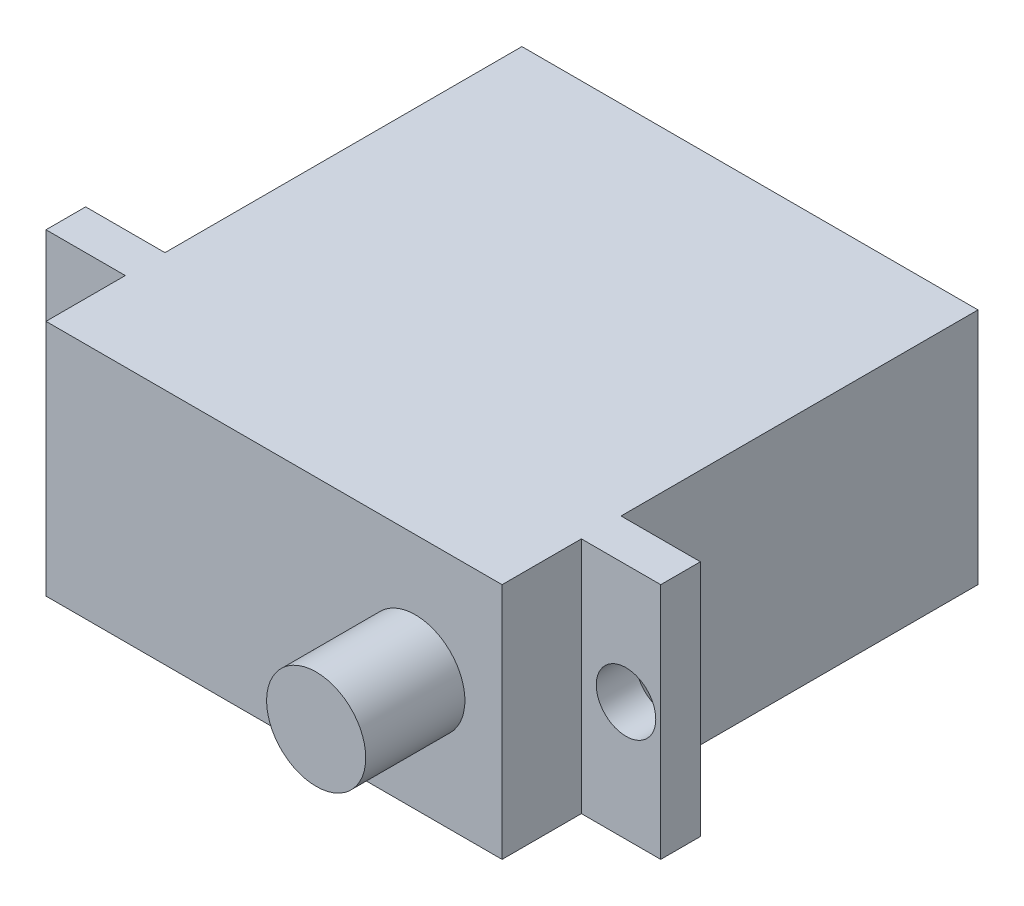
ISO-10303-21;
HEADER;
FILE_DESCRIPTION(('STEP AP214'),'2;1');
FILE_NAME('part.step','',(''),(''),'','','');
FILE_SCHEMA(('AUTOMOTIVE_DESIGN { 1 0 10303 214 1 1 1 1 }'));
ENDSEC;
DATA;
#1=APPLICATION_CONTEXT('core data for automotive mechanical design processes');
#2=APPLICATION_PROTOCOL_DEFINITION('international standard','automotive_design',2000,#1);
#3=PRODUCT_CONTEXT('',#1,'mechanical');
#4=PRODUCT('Part','Part','',(#3));
#5=PRODUCT_RELATED_PRODUCT_CATEGORY('part','',(#4));
#6=PRODUCT_DEFINITION_FORMATION('','',#4);
#7=PRODUCT_DEFINITION_CONTEXT('part definition',#1,'design');
#8=PRODUCT_DEFINITION('design','',#6,#7);
#9=PRODUCT_DEFINITION_SHAPE('','',#8);
#10=(LENGTH_UNIT() NAMED_UNIT(*) SI_UNIT(.MILLI.,.METRE.));
#11=(NAMED_UNIT(*) PLANE_ANGLE_UNIT() SI_UNIT($,.RADIAN.));
#12=(NAMED_UNIT(*) SI_UNIT($,.STERADIAN.) SOLID_ANGLE_UNIT());
#13=UNCERTAINTY_MEASURE_WITH_UNIT(LENGTH_MEASURE(1.E-05),#10,'distance_accuracy_value','');
#14=(GEOMETRIC_REPRESENTATION_CONTEXT(3) GLOBAL_UNCERTAINTY_ASSIGNED_CONTEXT((#13)) GLOBAL_UNIT_ASSIGNED_CONTEXT((#10,
#11,#12)) REPRESENTATION_CONTEXT('',''));
#15=CARTESIAN_POINT('',(0.,0.,0.));
#16=DIRECTION('',(0.,0.,1.));
#17=DIRECTION('',(1.,0.,0.));
#18=AXIS2_PLACEMENT_3D('',#15,#16,#17);
#19=CARTESIAN_POINT('',(0.,0.,20.));
#20=DIRECTION('',(0.,0.,-1.));
#21=DIRECTION('',(-1.,0.,0.));
#22=AXIS2_PLACEMENT_3D('',#19,#20,#21);
#23=PLANE('',#22);
#24=CARTESIAN_POINT('',(-2.25,6.,20.));
#25=DIRECTION('',(0.,0.,1.));
#26=DIRECTION('',(1.,0.,0.));
#27=AXIS2_PLACEMENT_3D('',#24,#25,#26);
#28=CIRCLE('',#27,1.5);
#29=CARTESIAN_POINT('',(-0.75,6.,20.));
#30=VERTEX_POINT('',#29);
#31=EDGE_CURVE('E164',#30,#30,#28,.T.);
#32=ORIENTED_EDGE('',*,*,#31,.F.);
#33=EDGE_LOOP('',(#32));
#34=FACE_BOUND('',#33,.T.);
#35=DIRECTION('',(0.,-1.,0.));
#36=VECTOR('',#35,1.);
#37=CARTESIAN_POINT('',(0.,0.,20.));
#38=LINE('',#37,#36);
#39=CARTESIAN_POINT('',(0.,12.,20.));
#40=VERTEX_POINT('',#39);
#41=CARTESIAN_POINT('',(0.,0.,20.));
#42=VERTEX_POINT('',#41);
#43=EDGE_CURVE('E150',#40,#42,#38,.T.);
#44=ORIENTED_EDGE('',*,*,#43,.F.);
#45=DIRECTION('',(-1.,0.,0.));
#46=VECTOR('',#45,1.);
#47=CARTESIAN_POINT('',(0.,12.,20.));
#48=LINE('',#47,#46);
#49=CARTESIAN_POINT('',(-4.,12.,20.));
#50=VERTEX_POINT('',#49);
#51=EDGE_CURVE('E211',#40,#50,#48,.T.);
#52=ORIENTED_EDGE('',*,*,#51,.T.);
#53=DIRECTION('',(0.,-1.,0.));
#54=VECTOR('',#53,1.);
#55=CARTESIAN_POINT('',(-4.,12.,20.));
#56=LINE('',#55,#54);
#57=CARTESIAN_POINT('',(-4.,0.,20.));
#58=VERTEX_POINT('',#57);
#59=EDGE_CURVE('E163',#50,#58,#56,.T.);
#60=ORIENTED_EDGE('',*,*,#59,.T.);
#61=DIRECTION('',(1.,0.,0.));
#62=VECTOR('',#61,1.);
#63=CARTESIAN_POINT('',(0.,0.,20.));
#64=LINE('',#63,#62);
#65=EDGE_CURVE('E62',#58,#42,#64,.T.);
#66=ORIENTED_EDGE('',*,*,#65,.T.);
#67=EDGE_LOOP('',(#44,#52,#60,#66));
#68=FACE_BOUND('',#67,.T.);
#69=ADVANCED_FACE('F39',(#34,#68),#23,.F.);
#70=CARTESIAN_POINT('',(25.25,6.,20.));
#71=DIRECTION('',(0.,0.,1.));
#72=DIRECTION('',(1.,0.,0.));
#73=AXIS2_PLACEMENT_3D('',#70,#71,#72);
#74=CIRCLE('',#73,1.5);
#75=CARTESIAN_POINT('',(26.75,6.,20.));
#76=VERTEX_POINT('',#75);
#77=EDGE_CURVE('E167',#76,#76,#74,.T.);
#78=ORIENTED_EDGE('',*,*,#77,.F.);
#79=EDGE_LOOP('',(#78));
#80=FACE_BOUND('',#79,.T.);
#81=DIRECTION('',(0.,1.,0.));
#82=VECTOR('',#81,1.);
#83=CARTESIAN_POINT('',(23.,0.,20.));
#84=LINE('',#83,#82);
#85=CARTESIAN_POINT('',(23.,0.,20.));
#86=VERTEX_POINT('',#85);
#87=CARTESIAN_POINT('',(23.,12.,20.));
#88=VERTEX_POINT('',#87);
#89=EDGE_CURVE('E54',#86,#88,#84,.T.);
#90=ORIENTED_EDGE('',*,*,#89,.F.);
#91=CARTESIAN_POINT('',(27.,0.,20.));
#92=VERTEX_POINT('',#91);
#93=EDGE_CURVE('E212',#86,#92,#64,.T.);
#94=ORIENTED_EDGE('',*,*,#93,.T.);
#95=DIRECTION('',(0.,1.,0.));
#96=VECTOR('',#95,1.);
#97=CARTESIAN_POINT('',(27.,12.,20.));
#98=LINE('',#97,#96);
#99=CARTESIAN_POINT('',(27.,12.,20.));
#100=VERTEX_POINT('',#99);
#101=EDGE_CURVE('E191',#92,#100,#98,.T.);
#102=ORIENTED_EDGE('',*,*,#101,.T.);
#103=EDGE_CURVE('E213',#100,#88,#48,.T.);
#104=ORIENTED_EDGE('',*,*,#103,.T.);
#105=EDGE_LOOP('',(#90,#94,#102,#104));
#106=FACE_BOUND('',#105,.T.);
#107=ADVANCED_FACE('F253',(#80,#106),#23,.F.);
#108=CARTESIAN_POINT('',(0.,0.,20.));
#109=DIRECTION('',(1.,0.,0.));
#110=DIRECTION('',(0.,0.,-1.));
#111=AXIS2_PLACEMENT_3D('',#108,#109,#110);
#112=PLANE('',#111);
#113=DIRECTION('',(0.,0.,-1.));
#114=VECTOR('',#113,1.);
#115=CARTESIAN_POINT('',(0.,0.,20.));
#116=LINE('',#115,#114);
#117=CARTESIAN_POINT('',(0.,0.,18.));
#118=VERTEX_POINT('',#117);
#119=CARTESIAN_POINT('',(0.,0.,0.));
#120=VERTEX_POINT('',#119);
#121=EDGE_CURVE('E47',#118,#120,#116,.T.);
#122=ORIENTED_EDGE('',*,*,#121,.F.);
#123=DIRECTION('',(0.,1.,0.));
#124=VECTOR('',#123,1.);
#125=CARTESIAN_POINT('',(0.,12.,18.));
#126=LINE('',#125,#124);
#127=CARTESIAN_POINT('',(0.,12.,18.));
#128=VERTEX_POINT('',#127);
#129=EDGE_CURVE('E168',#118,#128,#126,.T.);
#130=ORIENTED_EDGE('',*,*,#129,.T.);
#131=DIRECTION('',(0.,0.,-1.));
#132=VECTOR('',#131,1.);
#133=CARTESIAN_POINT('',(0.,12.,20.));
#134=LINE('',#133,#132);
#135=CARTESIAN_POINT('',(0.,12.,0.));
#136=VERTEX_POINT('',#135);
#137=EDGE_CURVE('E215',#128,#136,#134,.T.);
#138=ORIENTED_EDGE('',*,*,#137,.T.);
#139=DIRECTION('',(0.,-1.,0.));
#140=VECTOR('',#139,1.);
#141=CARTESIAN_POINT('',(0.,0.,0.));
#142=LINE('',#141,#140);
#143=EDGE_CURVE('E185',#136,#120,#142,.T.);
#144=ORIENTED_EDGE('',*,*,#143,.T.);
#145=EDGE_LOOP('',(#122,#130,#138,#144));
#146=FACE_BOUND('',#145,.T.);
#147=ADVANCED_FACE('F41',(#146),#112,.F.);
#148=CARTESIAN_POINT('',(0.,0.,20.));
#149=DIRECTION('',(0.,1.,0.));
#150=DIRECTION('',(0.,0.,1.));
#151=AXIS2_PLACEMENT_3D('',#148,#149,#150);
#152=PLANE('',#151);
#153=DIRECTION('',(1.,0.,0.));
#154=VECTOR('',#153,1.);
#155=CARTESIAN_POINT('',(0.,0.,0.));
#156=LINE('',#155,#154);
#157=CARTESIAN_POINT('',(23.,0.,0.));
#158=VERTEX_POINT('',#157);
#159=EDGE_CURVE('E218',#120,#158,#156,.T.);
#160=ORIENTED_EDGE('',*,*,#159,.T.);
#161=DIRECTION('',(0.,0.,-1.));
#162=VECTOR('',#161,1.);
#163=CARTESIAN_POINT('',(23.,0.,20.));
#164=LINE('',#163,#162);
#165=CARTESIAN_POINT('',(23.,0.,18.));
#166=VERTEX_POINT('',#165);
#167=EDGE_CURVE('E229',#166,#158,#164,.T.);
#168=ORIENTED_EDGE('',*,*,#167,.F.);
#169=DIRECTION('',(1.,0.,0.));
#170=VECTOR('',#169,1.);
#171=CARTESIAN_POINT('',(23.,0.,18.));
#172=LINE('',#171,#170);
#173=CARTESIAN_POINT('',(27.,0.,18.));
#174=VERTEX_POINT('',#173);
#175=EDGE_CURVE('E201',#166,#174,#172,.T.);
#176=ORIENTED_EDGE('',*,*,#175,.T.);
#177=DIRECTION('',(0.,0.,1.));
#178=VECTOR('',#177,1.);
#179=CARTESIAN_POINT('',(27.,0.,18.));
#180=LINE('',#179,#178);
#181=EDGE_CURVE('E154',#174,#92,#180,.T.);
#182=ORIENTED_EDGE('',*,*,#181,.T.);
#183=ORIENTED_EDGE('',*,*,#93,.F.);
#184=DIRECTION('',(0.,0.,-1.));
#185=VECTOR('',#184,1.);
#186=CARTESIAN_POINT('',(23.,0.,24.));
#187=LINE('',#186,#185);
#188=CARTESIAN_POINT('',(23.,0.,24.));
#189=VERTEX_POINT('',#188);
#190=EDGE_CURVE('E135',#189,#86,#187,.T.);
#191=ORIENTED_EDGE('',*,*,#190,.F.);
#192=DIRECTION('',(1.,0.,0.));
#193=VECTOR('',#192,1.);
#194=CARTESIAN_POINT('',(0.,0.,24.));
#195=LINE('',#194,#193);
#196=CARTESIAN_POINT('',(0.,0.,24.));
#197=VERTEX_POINT('',#196);
#198=EDGE_CURVE('E127',#197,#189,#195,.T.);
#199=ORIENTED_EDGE('',*,*,#198,.F.);
#200=DIRECTION('',(0.,0.,-1.));
#201=VECTOR('',#200,1.);
#202=CARTESIAN_POINT('',(0.,0.,24.));
#203=LINE('',#202,#201);
#204=EDGE_CURVE('E132',#197,#42,#203,.T.);
#205=ORIENTED_EDGE('',*,*,#204,.T.);
#206=ORIENTED_EDGE('',*,*,#65,.F.);
#207=DIRECTION('',(0.,0.,1.));
#208=VECTOR('',#207,1.);
#209=CARTESIAN_POINT('',(-4.,0.,18.));
#210=LINE('',#209,#208);
#211=CARTESIAN_POINT('',(-4.,0.,18.));
#212=VERTEX_POINT('',#211);
#213=EDGE_CURVE('E182',#212,#58,#210,.T.);
#214=ORIENTED_EDGE('',*,*,#213,.F.);
#215=DIRECTION('',(1.,0.,0.));
#216=VECTOR('',#215,1.);
#217=CARTESIAN_POINT('',(0.,0.,18.));
#218=LINE('',#217,#216);
#219=EDGE_CURVE('E177',#212,#118,#218,.T.);
#220=ORIENTED_EDGE('',*,*,#219,.T.);
#221=ORIENTED_EDGE('',*,*,#121,.T.);
#222=EDGE_LOOP('',(#160,#168,#176,#182,#183,#191,#199,#205,#206,#214,#220,#221));
#223=FACE_BOUND('',#222,.T.);
#224=ADVANCED_FACE('F130',(#223),#152,.F.);
#225=CARTESIAN_POINT('',(23.,0.,20.));
#226=DIRECTION('',(-1.,0.,0.));
#227=DIRECTION('',(0.,0.,1.));
#228=AXIS2_PLACEMENT_3D('',#225,#226,#227);
#229=PLANE('',#228);
#230=DIRECTION('',(0.,0.,-1.));
#231=VECTOR('',#230,1.);
#232=CARTESIAN_POINT('',(23.,12.,20.));
#233=LINE('',#232,#231);
#234=CARTESIAN_POINT('',(23.,12.,18.));
#235=VERTEX_POINT('',#234);
#236=CARTESIAN_POINT('',(23.,12.,0.));
#237=VERTEX_POINT('',#236);
#238=EDGE_CURVE('E227',#235,#237,#233,.T.);
#239=ORIENTED_EDGE('',*,*,#238,.F.);
#240=DIRECTION('',(0.,-1.,0.));
#241=VECTOR('',#240,1.);
#242=CARTESIAN_POINT('',(23.,12.,18.));
#243=LINE('',#242,#241);
#244=EDGE_CURVE('E195',#235,#166,#243,.T.);
#245=ORIENTED_EDGE('',*,*,#244,.T.);
#246=ORIENTED_EDGE('',*,*,#167,.T.);
#247=DIRECTION('',(0.,1.,0.));
#248=VECTOR('',#247,1.);
#249=CARTESIAN_POINT('',(23.,0.,0.));
#250=LINE('',#249,#248);
#251=EDGE_CURVE('E220',#158,#237,#250,.T.);
#252=ORIENTED_EDGE('',*,*,#251,.T.);
#253=EDGE_LOOP('',(#239,#245,#246,#252));
#254=FACE_BOUND('',#253,.T.);
#255=ADVANCED_FACE('F246',(#254),#229,.F.);
#256=CARTESIAN_POINT('',(0.,12.,20.));
#257=DIRECTION('',(0.,-1.,0.));
#258=DIRECTION('',(0.,0.,-1.));
#259=AXIS2_PLACEMENT_3D('',#256,#257,#258);
#260=PLANE('',#259);
#261=DIRECTION('',(-1.,0.,0.));
#262=VECTOR('',#261,1.);
#263=CARTESIAN_POINT('',(0.,12.,0.));
#264=LINE('',#263,#262);
#265=EDGE_CURVE('E223',#237,#136,#264,.T.);
#266=ORIENTED_EDGE('',*,*,#265,.T.);
#267=ORIENTED_EDGE('',*,*,#137,.F.);
#268=DIRECTION('',(-1.,0.,0.));
#269=VECTOR('',#268,1.);
#270=CARTESIAN_POINT('',(0.,12.,18.));
#271=LINE('',#270,#269);
#272=CARTESIAN_POINT('',(-4.,12.,18.));
#273=VERTEX_POINT('',#272);
#274=EDGE_CURVE('E171',#128,#273,#271,.T.);
#275=ORIENTED_EDGE('',*,*,#274,.T.);
#276=DIRECTION('',(0.,0.,1.));
#277=VECTOR('',#276,1.);
#278=CARTESIAN_POINT('',(-4.,12.,18.));
#279=LINE('',#278,#277);
#280=EDGE_CURVE('E180',#273,#50,#279,.T.);
#281=ORIENTED_EDGE('',*,*,#280,.T.);
#282=ORIENTED_EDGE('',*,*,#51,.F.);
#283=DIRECTION('',(0.,0.,-1.));
#284=VECTOR('',#283,1.);
#285=CARTESIAN_POINT('',(0.,12.,24.));
#286=LINE('',#285,#284);
#287=CARTESIAN_POINT('',(0.,12.,24.));
#288=VERTEX_POINT('',#287);
#289=EDGE_CURVE('E259',#288,#40,#286,.T.);
#290=ORIENTED_EDGE('',*,*,#289,.F.);
#291=DIRECTION('',(-1.,0.,0.));
#292=VECTOR('',#291,1.);
#293=CARTESIAN_POINT('',(0.,12.,24.));
#294=LINE('',#293,#292);
#295=CARTESIAN_POINT('',(23.,12.,24.));
#296=VERTEX_POINT('',#295);
#297=EDGE_CURVE('E144',#296,#288,#294,.T.);
#298=ORIENTED_EDGE('',*,*,#297,.F.);
#299=DIRECTION('',(0.,0.,-1.));
#300=VECTOR('',#299,1.);
#301=CARTESIAN_POINT('',(23.,12.,24.));
#302=LINE('',#301,#300);
#303=EDGE_CURVE('E156',#296,#88,#302,.T.);
#304=ORIENTED_EDGE('',*,*,#303,.T.);
#305=ORIENTED_EDGE('',*,*,#103,.F.);
#306=DIRECTION('',(0.,0.,1.));
#307=VECTOR('',#306,1.);
#308=CARTESIAN_POINT('',(27.,12.,18.));
#309=LINE('',#308,#307);
#310=CARTESIAN_POINT('',(27.,12.,18.));
#311=VERTEX_POINT('',#310);
#312=EDGE_CURVE('E151',#311,#100,#309,.T.);
#313=ORIENTED_EDGE('',*,*,#312,.F.);
#314=DIRECTION('',(-1.,0.,0.));
#315=VECTOR('',#314,1.);
#316=CARTESIAN_POINT('',(23.,12.,18.));
#317=LINE('',#316,#315);
#318=EDGE_CURVE('E189',#311,#235,#317,.T.);
#319=ORIENTED_EDGE('',*,*,#318,.T.);
#320=ORIENTED_EDGE('',*,*,#238,.T.);
#321=EDGE_LOOP('',(#266,#267,#275,#281,#282,#290,#298,#304,#305,#313,#319,#320));
#322=FACE_BOUND('',#321,.T.);
#323=ADVANCED_FACE('F242',(#322),#260,.F.);
#324=CARTESIAN_POINT('',(0.,0.,0.));
#325=DIRECTION('',(0.,0.,-1.));
#326=DIRECTION('',(-1.,0.,0.));
#327=AXIS2_PLACEMENT_3D('',#324,#325,#326);
#328=PLANE('',#327);
#329=ORIENTED_EDGE('',*,*,#143,.F.);
#330=ORIENTED_EDGE('',*,*,#265,.F.);
#331=ORIENTED_EDGE('',*,*,#251,.F.);
#332=ORIENTED_EDGE('',*,*,#159,.F.);
#333=EDGE_LOOP('',(#329,#330,#331,#332));
#334=FACE_BOUND('',#333,.T.);
#335=ADVANCED_FACE('F238',(#334),#328,.T.);
#336=CARTESIAN_POINT('',(27.,12.,18.));
#337=DIRECTION('',(1.,0.,0.));
#338=DIRECTION('',(0.,1.,0.));
#339=AXIS2_PLACEMENT_3D('',#336,#337,#338);
#340=PLANE('',#339);
#341=ORIENTED_EDGE('',*,*,#101,.F.);
#342=ORIENTED_EDGE('',*,*,#181,.F.);
#343=DIRECTION('',(0.,1.,0.));
#344=VECTOR('',#343,1.);
#345=CARTESIAN_POINT('',(27.,12.,18.));
#346=LINE('',#345,#344);
#347=EDGE_CURVE('E198',#174,#311,#346,.T.);
#348=ORIENTED_EDGE('',*,*,#347,.T.);
#349=ORIENTED_EDGE('',*,*,#312,.T.);
#350=EDGE_LOOP('',(#341,#342,#348,#349));
#351=FACE_BOUND('',#350,.T.);
#352=ADVANCED_FACE('F252',(#351),#340,.T.);
#353=CARTESIAN_POINT('',(0.,0.,18.));
#354=DIRECTION('',(0.,0.,1.));
#355=DIRECTION('',(1.,0.,0.));
#356=AXIS2_PLACEMENT_3D('',#353,#354,#355);
#357=PLANE('',#356);
#358=CARTESIAN_POINT('',(25.25,6.,18.));
#359=DIRECTION('',(0.,0.,1.));
#360=DIRECTION('',(1.,0.,0.));
#361=AXIS2_PLACEMENT_3D('',#358,#359,#360);
#362=CIRCLE('',#361,1.5);
#363=CARTESIAN_POINT('',(26.75,6.,18.));
#364=VERTEX_POINT('',#363);
#365=EDGE_CURVE('E194',#364,#364,#362,.T.);
#366=ORIENTED_EDGE('',*,*,#365,.T.);
#367=EDGE_LOOP('',(#366));
#368=FACE_BOUND('',#367,.T.);
#369=ORIENTED_EDGE('',*,*,#244,.F.);
#370=ORIENTED_EDGE('',*,*,#318,.F.);
#371=ORIENTED_EDGE('',*,*,#347,.F.);
#372=ORIENTED_EDGE('',*,*,#175,.F.);
#373=EDGE_LOOP('',(#369,#370,#371,#372));
#374=FACE_BOUND('',#373,.T.);
#375=ADVANCED_FACE('F250',(#368,#374),#357,.F.);
#376=CARTESIAN_POINT('',(25.25,6.,18.));
#377=DIRECTION('',(0.,0.,1.));
#378=DIRECTION('',(1.,0.,0.));
#379=AXIS2_PLACEMENT_3D('',#376,#377,#378);
#380=CYLINDRICAL_SURFACE('',#379,1.5);
#381=ORIENTED_EDGE('',*,*,#365,.F.);
#382=EDGE_LOOP('',(#381));
#383=FACE_BOUND('',#382,.T.);
#384=ORIENTED_EDGE('',*,*,#77,.T.);
#385=EDGE_LOOP('',(#384));
#386=FACE_BOUND('',#385,.T.);
#387=ADVANCED_FACE('F282',(#383,#386),#380,.F.);
#388=CARTESIAN_POINT('',(-4.,12.,18.));
#389=DIRECTION('',(-1.,0.,0.));
#390=DIRECTION('',(0.,-1.,0.));
#391=AXIS2_PLACEMENT_3D('',#388,#389,#390);
#392=PLANE('',#391);
#393=ORIENTED_EDGE('',*,*,#59,.F.);
#394=ORIENTED_EDGE('',*,*,#280,.F.);
#395=DIRECTION('',(0.,-1.,0.));
#396=VECTOR('',#395,1.);
#397=CARTESIAN_POINT('',(-4.,12.,18.));
#398=LINE('',#397,#396);
#399=EDGE_CURVE('E174',#273,#212,#398,.T.);
#400=ORIENTED_EDGE('',*,*,#399,.T.);
#401=ORIENTED_EDGE('',*,*,#213,.T.);
#402=EDGE_LOOP('',(#393,#394,#400,#401));
#403=FACE_BOUND('',#402,.T.);
#404=ADVANCED_FACE('F268',(#403),#392,.T.);
#405=CARTESIAN_POINT('',(0.,0.,18.));
#406=DIRECTION('',(0.,0.,-1.));
#407=DIRECTION('',(-1.,0.,0.));
#408=AXIS2_PLACEMENT_3D('',#405,#406,#407);
#409=PLANE('',#408);
#410=CARTESIAN_POINT('',(-2.25,6.,18.));
#411=DIRECTION('',(0.,0.,1.));
#412=DIRECTION('',(1.,0.,0.));
#413=AXIS2_PLACEMENT_3D('',#410,#411,#412);
#414=CIRCLE('',#413,1.5);
#415=CARTESIAN_POINT('',(-0.75,6.,18.));
#416=VERTEX_POINT('',#415);
#417=EDGE_CURVE('E160',#416,#416,#414,.T.);
#418=ORIENTED_EDGE('',*,*,#417,.T.);
#419=EDGE_LOOP('',(#418));
#420=FACE_BOUND('',#419,.T.);
#421=ORIENTED_EDGE('',*,*,#129,.F.);
#422=ORIENTED_EDGE('',*,*,#219,.F.);
#423=ORIENTED_EDGE('',*,*,#399,.F.);
#424=ORIENTED_EDGE('',*,*,#274,.F.);
#425=EDGE_LOOP('',(#421,#422,#423,#424));
#426=FACE_BOUND('',#425,.T.);
#427=ADVANCED_FACE('F271',(#420,#426),#409,.T.);
#428=CARTESIAN_POINT('',(-2.25,6.,18.));
#429=DIRECTION('',(0.,0.,1.));
#430=DIRECTION('',(1.,0.,0.));
#431=AXIS2_PLACEMENT_3D('',#428,#429,#430);
#432=CYLINDRICAL_SURFACE('',#431,1.5);
#433=ORIENTED_EDGE('',*,*,#417,.F.);
#434=EDGE_LOOP('',(#433));
#435=FACE_BOUND('',#434,.T.);
#436=ORIENTED_EDGE('',*,*,#31,.T.);
#437=EDGE_LOOP('',(#436));
#438=FACE_BOUND('',#437,.T.);
#439=ADVANCED_FACE('F273',(#435,#438),#432,.F.);
#440=CARTESIAN_POINT('',(0.,0.,24.));
#441=DIRECTION('',(1.,0.,0.));
#442=DIRECTION('',(0.,0.,-1.));
#443=AXIS2_PLACEMENT_3D('',#440,#441,#442);
#444=PLANE('',#443);
#445=ORIENTED_EDGE('',*,*,#43,.T.);
#446=ORIENTED_EDGE('',*,*,#204,.F.);
#447=DIRECTION('',(0.,-1.,0.));
#448=VECTOR('',#447,1.);
#449=CARTESIAN_POINT('',(0.,0.,24.));
#450=LINE('',#449,#448);
#451=EDGE_CURVE('E139',#288,#197,#450,.T.);
#452=ORIENTED_EDGE('',*,*,#451,.F.);
#453=ORIENTED_EDGE('',*,*,#289,.T.);
#454=EDGE_LOOP('',(#445,#446,#452,#453));
#455=FACE_BOUND('',#454,.T.);
#456=ADVANCED_FACE('F149',(#455),#444,.F.);
#457=CARTESIAN_POINT('',(23.,0.,24.));
#458=DIRECTION('',(-1.,0.,0.));
#459=DIRECTION('',(0.,0.,1.));
#460=AXIS2_PLACEMENT_3D('',#457,#458,#459);
#461=PLANE('',#460);
#462=ORIENTED_EDGE('',*,*,#89,.T.);
#463=ORIENTED_EDGE('',*,*,#303,.F.);
#464=DIRECTION('',(0.,1.,0.));
#465=VECTOR('',#464,1.);
#466=CARTESIAN_POINT('',(23.,0.,24.));
#467=LINE('',#466,#465);
#468=EDGE_CURVE('E138',#189,#296,#467,.T.);
#469=ORIENTED_EDGE('',*,*,#468,.F.);
#470=ORIENTED_EDGE('',*,*,#190,.T.);
#471=EDGE_LOOP('',(#462,#463,#469,#470));
#472=FACE_BOUND('',#471,.T.);
#473=ADVANCED_FACE('F255',(#472),#461,.F.);
#474=CARTESIAN_POINT('',(0.,0.,24.));
#475=DIRECTION('',(0.,0.,-1.));
#476=DIRECTION('',(-1.,0.,0.));
#477=AXIS2_PLACEMENT_3D('',#474,#475,#476);
#478=PLANE('',#477);
#479=CARTESIAN_POINT('',(18.623805866545,6.,24.));
#480=DIRECTION('',(0.,0.,-1.));
#481=DIRECTION('',(-1.,0.,0.));
#482=AXIS2_PLACEMENT_3D('',#479,#480,#481);
#483=CIRCLE('',#482,2.5);
#484=CARTESIAN_POINT('',(16.123805866545,6.,24.));
#485=VERTEX_POINT('',#484);
#486=EDGE_CURVE('E11',#485,#485,#483,.F.);
#487=ORIENTED_EDGE('',*,*,#486,.F.);
#488=EDGE_LOOP('',(#487));
#489=FACE_BOUND('',#488,.T.);
#490=ORIENTED_EDGE('',*,*,#451,.T.);
#491=ORIENTED_EDGE('',*,*,#198,.T.);
#492=ORIENTED_EDGE('',*,*,#468,.T.);
#493=ORIENTED_EDGE('',*,*,#297,.T.);
#494=EDGE_LOOP('',(#490,#491,#492,#493));
#495=FACE_BOUND('',#494,.T.);
#496=ADVANCED_FACE('F142',(#489,#495),#478,.F.);
#497=CARTESIAN_POINT('',(18.623805866545,6.,29.));
#498=DIRECTION('',(0.,0.,-1.));
#499=DIRECTION('',(-1.,0.,0.));
#500=AXIS2_PLACEMENT_3D('',#497,#498,#499);
#501=CYLINDRICAL_SURFACE('',#500,2.5);
#502=CARTESIAN_POINT('',(18.623805866545,6.,29.));
#503=DIRECTION('',(0.,0.,1.));
#504=DIRECTION('',(1.,0.,0.));
#505=AXIS2_PLACEMENT_3D('',#502,#503,#504);
#506=CIRCLE('',#505,2.5);
#507=CARTESIAN_POINT('',(21.123805866545,6.,29.));
#508=VERTEX_POINT('',#507);
#509=EDGE_CURVE('E263',#508,#508,#506,.T.);
#510=ORIENTED_EDGE('',*,*,#509,.F.);
#511=EDGE_LOOP('',(#510));
#512=FACE_BOUND('',#511,.T.);
#513=ORIENTED_EDGE('',*,*,#486,.T.);
#514=EDGE_LOOP('',(#513));
#515=FACE_BOUND('',#514,.T.);
#516=ADVANCED_FACE('F412',(#512,#515),#501,.T.);
#517=CARTESIAN_POINT('',(18.623805866545,6.,29.));
#518=DIRECTION('',(0.,0.,1.));
#519=DIRECTION('',(1.,0.,0.));
#520=AXIS2_PLACEMENT_3D('',#517,#518,#519);
#521=PLANE('',#520);
#522=ORIENTED_EDGE('',*,*,#509,.T.);
#523=EDGE_LOOP('',(#522));
#524=FACE_BOUND('',#523,.T.);
#525=ADVANCED_FACE('F422',(#524),#521,.T.);
#526=CLOSED_SHELL('',(#69,#107,#147,#224,#255,#323,#335,#352,#375,#387,#404,#427,#439,#456,#473,
#496,#516,#525));
#527=MANIFOLD_SOLID_BREP('B2',#526);
#528=ADVANCED_BREP_SHAPE_REPRESENTATION('',(#18,#527),#14);
#529=SHAPE_DEFINITION_REPRESENTATION(#9,#528);
ENDSEC;
END-ISO-10303-21;
